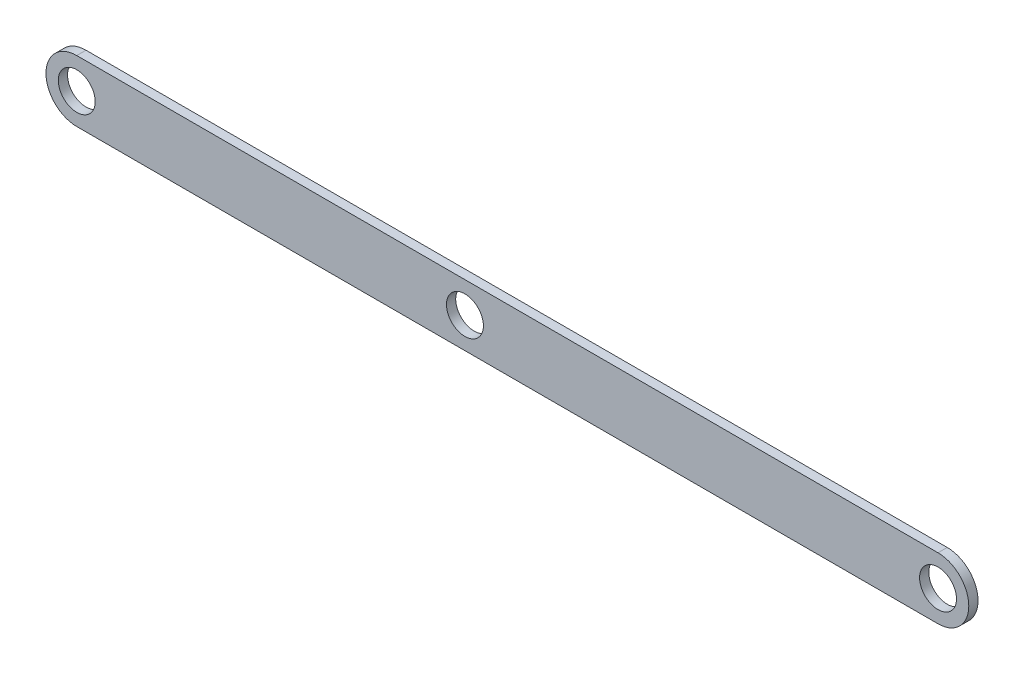
ISO-10303-21;
HEADER;
FILE_DESCRIPTION(('STEP AP214'),'2;1');
FILE_NAME('part.step','',(''),(''),'','','');
FILE_SCHEMA(('AUTOMOTIVE_DESIGN { 1 0 10303 214 1 1 1 1 }'));
ENDSEC;
DATA;
#1=APPLICATION_CONTEXT('core data for automotive mechanical design processes');
#2=APPLICATION_PROTOCOL_DEFINITION('international standard','automotive_design',2000,#1);
#3=PRODUCT_CONTEXT('',#1,'mechanical');
#4=PRODUCT('Part','Part','',(#3));
#5=PRODUCT_RELATED_PRODUCT_CATEGORY('part','',(#4));
#6=PRODUCT_DEFINITION_FORMATION('','',#4);
#7=PRODUCT_DEFINITION_CONTEXT('part definition',#1,'design');
#8=PRODUCT_DEFINITION('design','',#6,#7);
#9=PRODUCT_DEFINITION_SHAPE('','',#8);
#10=(LENGTH_UNIT() NAMED_UNIT(*) SI_UNIT(.MILLI.,.METRE.));
#11=(NAMED_UNIT(*) PLANE_ANGLE_UNIT() SI_UNIT($,.RADIAN.));
#12=(NAMED_UNIT(*) SI_UNIT($,.STERADIAN.) SOLID_ANGLE_UNIT());
#13=UNCERTAINTY_MEASURE_WITH_UNIT(LENGTH_MEASURE(1.E-05),#10,'distance_accuracy_value','');
#14=(GEOMETRIC_REPRESENTATION_CONTEXT(3) GLOBAL_UNCERTAINTY_ASSIGNED_CONTEXT((#13)) GLOBAL_UNIT_ASSIGNED_CONTEXT((#10,
#11,#12)) REPRESENTATION_CONTEXT('',''));
#15=CARTESIAN_POINT('',(0.,0.,0.));
#16=DIRECTION('',(0.,0.,1.));
#17=DIRECTION('',(1.,0.,0.));
#18=AXIS2_PLACEMENT_3D('',#15,#16,#17);
#19=CARTESIAN_POINT('',(0.,0.,1.5));
#20=DIRECTION('',(0.,0.,-1.));
#21=DIRECTION('',(-1.,0.,0.));
#22=AXIS2_PLACEMENT_3D('',#19,#20,#21);
#23=CYLINDRICAL_SURFACE('',#22,5.);
#24=CARTESIAN_POINT('',(0.,0.,0.));
#25=DIRECTION('',(0.,0.,1.));
#26=DIRECTION('',(1.,0.,0.));
#27=AXIS2_PLACEMENT_3D('',#24,#25,#26);
#28=CIRCLE('',#27,5.);
#29=CARTESIAN_POINT('',(0.,5.,0.));
#30=VERTEX_POINT('',#29);
#31=CARTESIAN_POINT('',(0.,-5.,0.));
#32=VERTEX_POINT('',#31);
#33=EDGE_CURVE('E107',#30,#32,#28,.T.);
#34=ORIENTED_EDGE('',*,*,#33,.T.);
#35=DIRECTION('',(0.,0.,-1.));
#36=VECTOR('',#35,1.);
#37=CARTESIAN_POINT('',(0.,-5.,1.5));
#38=LINE('',#37,#36);
#39=CARTESIAN_POINT('',(0.,-5.,1.5));
#40=VERTEX_POINT('',#39);
#41=EDGE_CURVE('E11',#40,#32,#38,.T.);
#42=ORIENTED_EDGE('',*,*,#41,.F.);
#43=CARTESIAN_POINT('',(0.,0.,1.5));
#44=DIRECTION('',(0.,0.,1.));
#45=DIRECTION('',(1.,0.,0.));
#46=AXIS2_PLACEMENT_3D('',#43,#44,#45);
#47=CIRCLE('',#46,5.);
#48=CARTESIAN_POINT('',(0.,5.,1.5));
#49=VERTEX_POINT('',#48);
#50=EDGE_CURVE('E91',#49,#40,#47,.T.);
#51=ORIENTED_EDGE('',*,*,#50,.F.);
#52=DIRECTION('',(0.,0.,-1.));
#53=VECTOR('',#52,1.);
#54=CARTESIAN_POINT('',(0.,5.,1.5));
#55=LINE('',#54,#53);
#56=EDGE_CURVE('E103',#49,#30,#55,.T.);
#57=ORIENTED_EDGE('',*,*,#56,.T.);
#58=EDGE_LOOP('',(#34,#42,#51,#57));
#59=FACE_BOUND('',#58,.T.);
#60=ADVANCED_FACE('F39',(#59),#23,.T.);
#61=CARTESIAN_POINT('',(0.,-5.,1.5));
#62=DIRECTION('',(0.,1.,0.));
#63=DIRECTION('',(-1.,0.,0.));
#64=AXIS2_PLACEMENT_3D('',#61,#62,#63);
#65=PLANE('',#64);
#66=DIRECTION('',(1.,0.,0.));
#67=VECTOR('',#66,1.);
#68=CARTESIAN_POINT('',(0.,-5.,0.));
#69=LINE('',#68,#67);
#70=CARTESIAN_POINT('',(140.,-4.99999999999999,0.));
#71=VERTEX_POINT('',#70);
#72=EDGE_CURVE('E96',#32,#71,#69,.T.);
#73=ORIENTED_EDGE('',*,*,#72,.T.);
#74=DIRECTION('',(0.,0.,-1.));
#75=VECTOR('',#74,1.);
#76=CARTESIAN_POINT('',(140.,-4.99999999999999,1.5));
#77=LINE('',#76,#75);
#78=CARTESIAN_POINT('',(140.,-4.99999999999999,1.5));
#79=VERTEX_POINT('',#78);
#80=EDGE_CURVE('E48',#79,#71,#77,.T.);
#81=ORIENTED_EDGE('',*,*,#80,.F.);
#82=DIRECTION('',(1.,0.,0.));
#83=VECTOR('',#82,1.);
#84=CARTESIAN_POINT('',(0.,-5.,1.5));
#85=LINE('',#84,#83);
#86=EDGE_CURVE('E86',#40,#79,#85,.T.);
#87=ORIENTED_EDGE('',*,*,#86,.F.);
#88=ORIENTED_EDGE('',*,*,#41,.T.);
#89=EDGE_LOOP('',(#73,#81,#87,#88));
#90=FACE_BOUND('',#89,.T.);
#91=ADVANCED_FACE('F95',(#90),#65,.F.);
#92=CARTESIAN_POINT('',(140.,0.,1.5));
#93=DIRECTION('',(0.,0.,-1.));
#94=DIRECTION('',(-1.,0.,0.));
#95=AXIS2_PLACEMENT_3D('',#92,#93,#94);
#96=CYLINDRICAL_SURFACE('',#95,4.99999999999999);
#97=CARTESIAN_POINT('',(140.,0.,0.));
#98=DIRECTION('',(0.,0.,1.));
#99=DIRECTION('',(1.,0.,0.));
#100=AXIS2_PLACEMENT_3D('',#97,#98,#99);
#101=CIRCLE('',#100,4.99999999999999);
#102=CARTESIAN_POINT('',(140.,4.99999999999999,0.));
#103=VERTEX_POINT('',#102);
#104=EDGE_CURVE('E73',#71,#103,#101,.T.);
#105=ORIENTED_EDGE('',*,*,#104,.T.);
#106=DIRECTION('',(0.,0.,-1.));
#107=VECTOR('',#106,1.);
#108=CARTESIAN_POINT('',(140.,4.99999999999999,1.5));
#109=LINE('',#108,#107);
#110=CARTESIAN_POINT('',(140.,4.99999999999999,1.5));
#111=VERTEX_POINT('',#110);
#112=EDGE_CURVE('E98',#111,#103,#109,.T.);
#113=ORIENTED_EDGE('',*,*,#112,.F.);
#114=CARTESIAN_POINT('',(140.,0.,1.5));
#115=DIRECTION('',(0.,0.,1.));
#116=DIRECTION('',(1.,0.,0.));
#117=AXIS2_PLACEMENT_3D('',#114,#115,#116);
#118=CIRCLE('',#117,4.99999999999999);
#119=EDGE_CURVE('E89',#79,#111,#118,.T.);
#120=ORIENTED_EDGE('',*,*,#119,.F.);
#121=ORIENTED_EDGE('',*,*,#80,.T.);
#122=EDGE_LOOP('',(#105,#113,#120,#121));
#123=FACE_BOUND('',#122,.T.);
#124=ADVANCED_FACE('F99',(#123),#96,.T.);
#125=CARTESIAN_POINT('',(0.,5.,1.5));
#126=DIRECTION('',(0.,-1.,0.));
#127=DIRECTION('',(1.,0.,0.));
#128=AXIS2_PLACEMENT_3D('',#125,#126,#127);
#129=PLANE('',#128);
#130=DIRECTION('',(-1.,0.,0.));
#131=VECTOR('',#130,1.);
#132=CARTESIAN_POINT('',(0.,5.,0.));
#133=LINE('',#132,#131);
#134=EDGE_CURVE('E79',#103,#30,#133,.T.);
#135=ORIENTED_EDGE('',*,*,#134,.T.);
#136=ORIENTED_EDGE('',*,*,#56,.F.);
#137=DIRECTION('',(-1.,0.,0.));
#138=VECTOR('',#137,1.);
#139=CARTESIAN_POINT('',(0.,5.,1.5));
#140=LINE('',#139,#138);
#141=EDGE_CURVE('E56',#111,#49,#140,.T.);
#142=ORIENTED_EDGE('',*,*,#141,.F.);
#143=ORIENTED_EDGE('',*,*,#112,.T.);
#144=EDGE_LOOP('',(#135,#136,#142,#143));
#145=FACE_BOUND('',#144,.T.);
#146=ADVANCED_FACE('F121',(#145),#129,.F.);
#147=CARTESIAN_POINT('',(0.,0.,1.5));
#148=DIRECTION('',(0.,0.,1.));
#149=DIRECTION('',(1.,0.,0.));
#150=AXIS2_PLACEMENT_3D('',#147,#148,#149);
#151=PLANE('',#150);
#152=CARTESIAN_POINT('',(0.,0.,1.5));
#153=DIRECTION('',(0.,0.,1.));
#154=DIRECTION('',(1.,0.,0.));
#155=AXIS2_PLACEMENT_3D('',#152,#153,#154);
#156=CIRCLE('',#155,3.);
#157=CARTESIAN_POINT('',(3.,0.,1.5));
#158=VERTEX_POINT('',#157);
#159=EDGE_CURVE('E144',#158,#158,#156,.T.);
#160=ORIENTED_EDGE('',*,*,#159,.F.);
#161=EDGE_LOOP('',(#160));
#162=FACE_BOUND('',#161,.T.);
#163=CARTESIAN_POINT('',(140.,0.,1.5));
#164=DIRECTION('',(0.,0.,1.));
#165=DIRECTION('',(1.,0.,0.));
#166=AXIS2_PLACEMENT_3D('',#163,#164,#165);
#167=CIRCLE('',#166,2.99999999999999);
#168=CARTESIAN_POINT('',(143.,0.,1.5));
#169=VERTEX_POINT('',#168);
#170=EDGE_CURVE('E136',#169,#169,#167,.T.);
#171=ORIENTED_EDGE('',*,*,#170,.F.);
#172=EDGE_LOOP('',(#171));
#173=FACE_BOUND('',#172,.T.);
#174=CARTESIAN_POINT('',(63.1,0.,1.5));
#175=DIRECTION('',(0.,0.,1.));
#176=DIRECTION('',(1.,0.,0.));
#177=AXIS2_PLACEMENT_3D('',#174,#175,#176);
#178=CIRCLE('',#177,3.00000000000001);
#179=CARTESIAN_POINT('',(66.1,0.,1.5));
#180=VERTEX_POINT('',#179);
#181=EDGE_CURVE('E128',#180,#180,#178,.T.);
#182=ORIENTED_EDGE('',*,*,#181,.F.);
#183=EDGE_LOOP('',(#182));
#184=FACE_BOUND('',#183,.T.);
#185=ORIENTED_EDGE('',*,*,#50,.T.);
#186=ORIENTED_EDGE('',*,*,#86,.T.);
#187=ORIENTED_EDGE('',*,*,#119,.T.);
#188=ORIENTED_EDGE('',*,*,#141,.T.);
#189=EDGE_LOOP('',(#185,#186,#187,#188));
#190=FACE_BOUND('',#189,.T.);
#191=ADVANCED_FACE('F87',(#162,#173,#184,#190),#151,.T.);
#192=CARTESIAN_POINT('',(0.,0.,0.));
#193=DIRECTION('',(0.,0.,1.));
#194=DIRECTION('',(1.,0.,0.));
#195=AXIS2_PLACEMENT_3D('',#192,#193,#194);
#196=PLANE('',#195);
#197=CARTESIAN_POINT('',(0.,0.,0.));
#198=DIRECTION('',(0.,0.,1.));
#199=DIRECTION('',(1.,0.,0.));
#200=AXIS2_PLACEMENT_3D('',#197,#198,#199);
#201=CIRCLE('',#200,3.);
#202=CARTESIAN_POINT('',(3.,0.,0.));
#203=VERTEX_POINT('',#202);
#204=EDGE_CURVE('E111',#203,#203,#201,.T.);
#205=ORIENTED_EDGE('',*,*,#204,.T.);
#206=EDGE_LOOP('',(#205));
#207=FACE_BOUND('',#206,.T.);
#208=CARTESIAN_POINT('',(140.,0.,0.));
#209=DIRECTION('',(0.,0.,1.));
#210=DIRECTION('',(1.,0.,0.));
#211=AXIS2_PLACEMENT_3D('',#208,#209,#210);
#212=CIRCLE('',#211,2.99999999999999);
#213=CARTESIAN_POINT('',(143.,0.,0.));
#214=VERTEX_POINT('',#213);
#215=EDGE_CURVE('E140',#214,#214,#212,.T.);
#216=ORIENTED_EDGE('',*,*,#215,.T.);
#217=EDGE_LOOP('',(#216));
#218=FACE_BOUND('',#217,.T.);
#219=CARTESIAN_POINT('',(63.1,0.,0.));
#220=DIRECTION('',(0.,0.,1.));
#221=DIRECTION('',(1.,0.,0.));
#222=AXIS2_PLACEMENT_3D('',#219,#220,#221);
#223=CIRCLE('',#222,3.00000000000001);
#224=CARTESIAN_POINT('',(66.1,0.,0.));
#225=VERTEX_POINT('',#224);
#226=EDGE_CURVE('E132',#225,#225,#223,.T.);
#227=ORIENTED_EDGE('',*,*,#226,.T.);
#228=EDGE_LOOP('',(#227));
#229=FACE_BOUND('',#228,.T.);
#230=ORIENTED_EDGE('',*,*,#33,.F.);
#231=ORIENTED_EDGE('',*,*,#134,.F.);
#232=ORIENTED_EDGE('',*,*,#104,.F.);
#233=ORIENTED_EDGE('',*,*,#72,.F.);
#234=EDGE_LOOP('',(#230,#231,#232,#233));
#235=FACE_BOUND('',#234,.T.);
#236=ADVANCED_FACE('F124',(#207,#218,#229,#235),#196,.F.);
#237=CARTESIAN_POINT('',(63.1,0.,0.));
#238=DIRECTION('',(0.,0.,1.));
#239=DIRECTION('',(1.,0.,0.));
#240=AXIS2_PLACEMENT_3D('',#237,#238,#239);
#241=CYLINDRICAL_SURFACE('',#240,3.00000000000001);
#242=ORIENTED_EDGE('',*,*,#226,.F.);
#243=EDGE_LOOP('',(#242));
#244=FACE_BOUND('',#243,.T.);
#245=ORIENTED_EDGE('',*,*,#181,.T.);
#246=EDGE_LOOP('',(#245));
#247=FACE_BOUND('',#246,.T.);
#248=ADVANCED_FACE('F168',(#244,#247),#241,.F.);
#249=CARTESIAN_POINT('',(140.,0.,0.));
#250=DIRECTION('',(0.,0.,1.));
#251=DIRECTION('',(1.,0.,0.));
#252=AXIS2_PLACEMENT_3D('',#249,#250,#251);
#253=CYLINDRICAL_SURFACE('',#252,2.99999999999999);
#254=ORIENTED_EDGE('',*,*,#215,.F.);
#255=EDGE_LOOP('',(#254));
#256=FACE_BOUND('',#255,.T.);
#257=ORIENTED_EDGE('',*,*,#170,.T.);
#258=EDGE_LOOP('',(#257));
#259=FACE_BOUND('',#258,.T.);
#260=ADVANCED_FACE('F157',(#256,#259),#253,.F.);
#261=CARTESIAN_POINT('',(0.,0.,0.));
#262=DIRECTION('',(0.,0.,1.));
#263=DIRECTION('',(1.,0.,0.));
#264=AXIS2_PLACEMENT_3D('',#261,#262,#263);
#265=CYLINDRICAL_SURFACE('',#264,3.);
#266=ORIENTED_EDGE('',*,*,#204,.F.);
#267=EDGE_LOOP('',(#266));
#268=FACE_BOUND('',#267,.T.);
#269=ORIENTED_EDGE('',*,*,#159,.T.);
#270=EDGE_LOOP('',(#269));
#271=FACE_BOUND('',#270,.T.);
#272=ADVANCED_FACE('F154',(#268,#271),#265,.F.);
#273=CLOSED_SHELL('',(#60,#91,#124,#146,#191,#236,#248,#260,#272));
#274=MANIFOLD_SOLID_BREP('B2',#273);
#275=ADVANCED_BREP_SHAPE_REPRESENTATION('',(#18,#274),#14);
#276=SHAPE_DEFINITION_REPRESENTATION(#9,#275);
ENDSEC;
END-ISO-10303-21;
